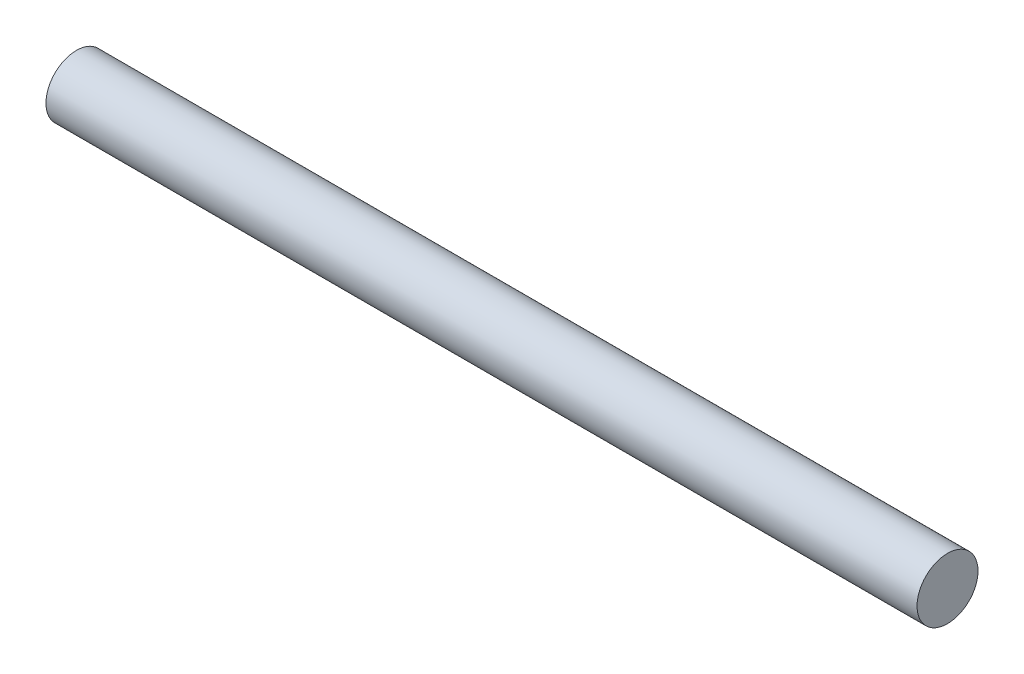
ISO-10303-21;
HEADER;
FILE_DESCRIPTION(('STEP AP214'),'2;1');
FILE_NAME('part.step','',(''),(''),'','','');
FILE_SCHEMA(('AUTOMOTIVE_DESIGN { 1 0 10303 214 1 1 1 1 }'));
ENDSEC;
DATA;
#1=APPLICATION_CONTEXT('core data for automotive mechanical design processes');
#2=APPLICATION_PROTOCOL_DEFINITION('international standard','automotive_design',2000,#1);
#3=PRODUCT_CONTEXT('',#1,'mechanical');
#4=PRODUCT('Part','Part','',(#3));
#5=PRODUCT_RELATED_PRODUCT_CATEGORY('part','',(#4));
#6=PRODUCT_DEFINITION_FORMATION('','',#4);
#7=PRODUCT_DEFINITION_CONTEXT('part definition',#1,'design');
#8=PRODUCT_DEFINITION('design','',#6,#7);
#9=PRODUCT_DEFINITION_SHAPE('','',#8);
#10=(LENGTH_UNIT() NAMED_UNIT(*) SI_UNIT(.MILLI.,.METRE.));
#11=(NAMED_UNIT(*) PLANE_ANGLE_UNIT() SI_UNIT($,.RADIAN.));
#12=(NAMED_UNIT(*) SI_UNIT($,.STERADIAN.) SOLID_ANGLE_UNIT());
#13=UNCERTAINTY_MEASURE_WITH_UNIT(LENGTH_MEASURE(1.E-05),#10,'distance_accuracy_value','');
#14=(GEOMETRIC_REPRESENTATION_CONTEXT(3) GLOBAL_UNCERTAINTY_ASSIGNED_CONTEXT((#13)) GLOBAL_UNIT_ASSIGNED_CONTEXT((#10,
#11,#12)) REPRESENTATION_CONTEXT('',''));
#15=CARTESIAN_POINT('',(0.,0.,0.));
#16=DIRECTION('',(0.,0.,1.));
#17=DIRECTION('',(1.,0.,0.));
#18=AXIS2_PLACEMENT_3D('',#15,#16,#17);
#19=CARTESIAN_POINT('',(-79.6567727267643,0.,0.));
#20=DIRECTION('',(1.,0.,0.));
#21=DIRECTION('',(0.,0.,-1.));
#22=AXIS2_PLACEMENT_3D('',#19,#20,#21);
#23=CYLINDRICAL_SURFACE('',#22,1.575);
#24=CARTESIAN_POINT('',(-79.6567727267643,0.,0.));
#25=DIRECTION('',(1.,0.,0.));
#26=DIRECTION('',(0.,0.,-1.));
#27=AXIS2_PLACEMENT_3D('',#24,#25,#26);
#28=CIRCLE('',#27,1.575);
#29=CARTESIAN_POINT('',(-79.6567727267643,0.,-1.575));
#30=VERTEX_POINT('',#29);
#31=EDGE_CURVE('E10',#30,#30,#28,.T.);
#32=CARTESIAN_POINT('',(-34.6567727267643,0.,0.));
#33=DIRECTION('',(1.,0.,0.));
#34=DIRECTION('',(0.,0.,-1.));
#35=AXIS2_PLACEMENT_3D('',#32,#33,#34);
#36=CIRCLE('',#35,1.575);
#37=CARTESIAN_POINT('',(-34.6567727267643,0.,-1.575));
#38=VERTEX_POINT('',#37);
#39=EDGE_CURVE('E33',#38,#38,#36,.T.);
#40=CARTESIAN_POINT('',(-79.6567727267643,0.,-1.575));
#41=CARTESIAN_POINT('',(-79.1880227267643,0.,-1.575));
#42=CARTESIAN_POINT('',(-78.7192727267643,0.,-1.575));
#43=CARTESIAN_POINT('',(-77.7817727267643,0.,-1.575));
#44=CARTESIAN_POINT('',(-77.3130227267643,0.,-1.575));
#45=CARTESIAN_POINT('',(-76.3755227267643,0.,-1.575));
#46=CARTESIAN_POINT('',(-75.9067727267643,0.,-1.575));
#47=CARTESIAN_POINT('',(-74.9692727267643,0.,-1.575));
#48=CARTESIAN_POINT('',(-74.5005227267643,0.,-1.575));
#49=CARTESIAN_POINT('',(-73.5630227267643,0.,-1.575));
#50=CARTESIAN_POINT('',(-73.0942727267643,0.,-1.575));
#51=CARTESIAN_POINT('',(-72.1567727267643,0.,-1.575));
#52=CARTESIAN_POINT('',(-71.6880227267643,0.,-1.575));
#53=CARTESIAN_POINT('',(-70.7505227267643,0.,-1.575));
#54=CARTESIAN_POINT('',(-70.2817727267643,0.,-1.575));
#55=CARTESIAN_POINT('',(-69.3442727267643,0.,-1.575));
#56=CARTESIAN_POINT('',(-68.8755227267643,0.,-1.575));
#57=CARTESIAN_POINT('',(-67.9380227267643,0.,-1.575));
#58=CARTESIAN_POINT('',(-67.4692727267643,0.,-1.575));
#59=CARTESIAN_POINT('',(-66.5317727267643,0.,-1.575));
#60=CARTESIAN_POINT('',(-66.0630227267643,0.,-1.575));
#61=CARTESIAN_POINT('',(-65.1255227267643,0.,-1.575));
#62=CARTESIAN_POINT('',(-64.6567727267643,0.,-1.575));
#63=CARTESIAN_POINT('',(-63.7192727267643,0.,-1.575));
#64=CARTESIAN_POINT('',(-63.2505227267643,0.,-1.575));
#65=CARTESIAN_POINT('',(-62.3130227267643,0.,-1.575));
#66=CARTESIAN_POINT('',(-61.8442727267643,0.,-1.575));
#67=CARTESIAN_POINT('',(-60.9067727267643,0.,-1.575));
#68=CARTESIAN_POINT('',(-60.4380227267643,0.,-1.575));
#69=CARTESIAN_POINT('',(-59.5005227267643,0.,-1.575));
#70=CARTESIAN_POINT('',(-59.0317727267643,0.,-1.575));
#71=CARTESIAN_POINT('',(-58.0942727267643,0.,-1.575));
#72=CARTESIAN_POINT('',(-57.6255227267643,0.,-1.575));
#73=CARTESIAN_POINT('',(-56.6880227267643,0.,-1.575));
#74=CARTESIAN_POINT('',(-56.2192727267643,0.,-1.575));
#75=CARTESIAN_POINT('',(-55.2817727267643,0.,-1.575));
#76=CARTESIAN_POINT('',(-54.8130227267643,0.,-1.575));
#77=CARTESIAN_POINT('',(-53.8755227267643,0.,-1.575));
#78=CARTESIAN_POINT('',(-53.4067727267643,0.,-1.575));
#79=CARTESIAN_POINT('',(-52.4692727267643,0.,-1.575));
#80=CARTESIAN_POINT('',(-52.0005227267643,0.,-1.575));
#81=CARTESIAN_POINT('',(-51.0630227267643,0.,-1.575));
#82=CARTESIAN_POINT('',(-50.5942727267643,0.,-1.575));
#83=CARTESIAN_POINT('',(-49.6567727267643,0.,-1.575));
#84=CARTESIAN_POINT('',(-49.1880227267643,0.,-1.575));
#85=CARTESIAN_POINT('',(-48.2505227267643,0.,-1.575));
#86=CARTESIAN_POINT('',(-47.7817727267643,0.,-1.575));
#87=CARTESIAN_POINT('',(-46.8442727267643,0.,-1.575));
#88=CARTESIAN_POINT('',(-46.3755227267643,0.,-1.575));
#89=CARTESIAN_POINT('',(-45.4380227267643,0.,-1.575));
#90=CARTESIAN_POINT('',(-44.9692727267643,0.,-1.575));
#91=CARTESIAN_POINT('',(-44.0317727267643,0.,-1.575));
#92=CARTESIAN_POINT('',(-43.5630227267643,0.,-1.575));
#93=CARTESIAN_POINT('',(-42.6255227267643,0.,-1.575));
#94=CARTESIAN_POINT('',(-42.1567727267643,0.,-1.575));
#95=CARTESIAN_POINT('',(-41.2192727267643,0.,-1.575));
#96=CARTESIAN_POINT('',(-40.7505227267643,0.,-1.575));
#97=CARTESIAN_POINT('',(-39.8130227267643,0.,-1.575));
#98=CARTESIAN_POINT('',(-39.3442727267643,0.,-1.575));
#99=CARTESIAN_POINT('',(-38.4067727267643,0.,-1.575));
#100=CARTESIAN_POINT('',(-37.9380227267643,0.,-1.575));
#101=CARTESIAN_POINT('',(-37.0005227267643,0.,-1.575));
#102=CARTESIAN_POINT('',(-36.5317727267643,0.,-1.575));
#103=CARTESIAN_POINT('',(-35.5942727267643,0.,-1.575));
#104=CARTESIAN_POINT('',(-35.1255227267643,0.,-1.575));
#105=CARTESIAN_POINT('',(-34.6567727267643,0.,-1.575));
#106=B_SPLINE_CURVE_WITH_KNOTS('',3,(#40,#41,#42,#43,#44,#45,#46,#47,#48,#49,#50,#51,#52,#53,
#54,#55,#56,#57,#58,#59,#60,#61,#62,#63,#64,#65,#66,#67,#68,#69,#70,#71,#72,#73,#74,#75,#76,#77,
#78,#79,#80,#81,#82,#83,#84,#85,#86,#87,#88,#89,#90,#91,#92,#93,#94,#95,#96,#97,#98,#99,#100,
#101,#102,#103,#104,#105),.UNSPECIFIED.,.F.,.F.,(4,2,2,2,2,2,2,2,2,2,2,2,2,2,2,2,2,2,2,2,2,2,2,
2,2,2,2,2,2,2,2,2,4),(0.,1.40625,2.8125,4.21874999999999,5.62499999999999,7.03124999999999,
8.43749999999999,9.84375,11.25,12.65625,14.0625,15.46875,16.875,18.28125,19.6875,21.09375,22.5,
23.90625,25.3125,26.71875,28.125,29.53125,30.9375,32.34375,33.75,35.15625,36.5625,37.96875,
39.375,40.78125,42.1875,43.59375,45.),.UNSPECIFIED.);
#107=EDGE_CURVE('BSEAM30',#30,#38,#106,.T.);
#108=ORIENTED_EDGE('',*,*,#31,.T.);
#109=ORIENTED_EDGE('',*,*,#39,.F.);
#110=ORIENTED_EDGE('',*,*,#107,.T.);
#111=ORIENTED_EDGE('',*,*,#107,.F.);
#112=EDGE_LOOP('',(#108,#110,#109,#111));
#113=FACE_BOUND('',#112,.T.);
#114=ADVANCED_FACE('F30',(#113),#23,.T.);
#115=CARTESIAN_POINT('',(-79.6567727267643,0.,0.));
#116=DIRECTION('',(1.,0.,0.));
#117=DIRECTION('',(0.,0.,-1.));
#118=AXIS2_PLACEMENT_3D('',#115,#116,#117);
#119=PLANE('',#118);
#120=ORIENTED_EDGE('',*,*,#31,.F.);
#121=EDGE_LOOP('',(#120));
#122=FACE_BOUND('',#121,.T.);
#123=ADVANCED_FACE('F45',(#122),#119,.F.);
#124=CARTESIAN_POINT('',(-34.6567727267643,0.,0.));
#125=DIRECTION('',(1.,0.,0.));
#126=DIRECTION('',(0.,0.,-1.));
#127=AXIS2_PLACEMENT_3D('',#124,#125,#126);
#128=PLANE('',#127);
#129=ORIENTED_EDGE('',*,*,#39,.T.);
#130=EDGE_LOOP('',(#129));
#131=FACE_BOUND('',#130,.T.);
#132=ADVANCED_FACE('F42',(#131),#128,.T.);
#133=CLOSED_SHELL('',(#114,#123,#132));
#134=MANIFOLD_SOLID_BREP('B2',#133);
#135=ADVANCED_BREP_SHAPE_REPRESENTATION('',(#18,#134),#14);
#136=SHAPE_DEFINITION_REPRESENTATION(#9,#135);
ENDSEC;
END-ISO-10303-21;
